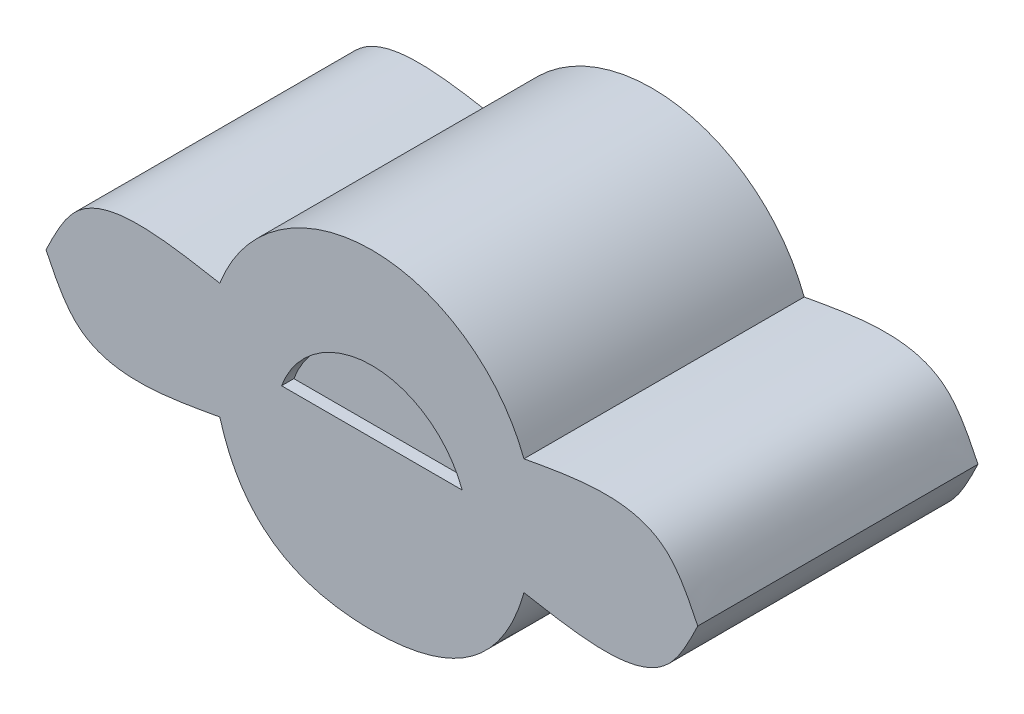
ISO-10303-21;
HEADER;
FILE_DESCRIPTION(('STEP AP214'),'2;1');
FILE_NAME('part.step','',(''),(''),'','','');
FILE_SCHEMA(('AUTOMOTIVE_DESIGN { 1 0 10303 214 1 1 1 1 }'));
ENDSEC;
DATA;
#1=APPLICATION_CONTEXT('core data for automotive mechanical design processes');
#2=APPLICATION_PROTOCOL_DEFINITION('international standard','automotive_design',2000,#1);
#3=PRODUCT_CONTEXT('',#1,'mechanical');
#4=PRODUCT('Part','Part','',(#3));
#5=PRODUCT_RELATED_PRODUCT_CATEGORY('part','',(#4));
#6=PRODUCT_DEFINITION_FORMATION('','',#4);
#7=PRODUCT_DEFINITION_CONTEXT('part definition',#1,'design');
#8=PRODUCT_DEFINITION('design','',#6,#7);
#9=PRODUCT_DEFINITION_SHAPE('','',#8);
#10=(LENGTH_UNIT() NAMED_UNIT(*) SI_UNIT(.MILLI.,.METRE.));
#11=(NAMED_UNIT(*) PLANE_ANGLE_UNIT() SI_UNIT($,.RADIAN.));
#12=(NAMED_UNIT(*) SI_UNIT($,.STERADIAN.) SOLID_ANGLE_UNIT());
#13=UNCERTAINTY_MEASURE_WITH_UNIT(LENGTH_MEASURE(1.E-05),#10,'distance_accuracy_value','');
#14=(GEOMETRIC_REPRESENTATION_CONTEXT(3) GLOBAL_UNCERTAINTY_ASSIGNED_CONTEXT((#13)) GLOBAL_UNIT_ASSIGNED_CONTEXT((#10,
#11,#12)) REPRESENTATION_CONTEXT('',''));
#15=CARTESIAN_POINT('',(0.,0.,0.));
#16=DIRECTION('',(0.,0.,1.));
#17=DIRECTION('',(1.,0.,0.));
#18=AXIS2_PLACEMENT_3D('',#15,#16,#17);
#19=CARTESIAN_POINT('',(3.44980996711875,-2.85158609272652,9.8298));
#20=DIRECTION('',(0.,0.,1.));
#21=DIRECTION('',(1.,0.,0.));
#22=AXIS2_PLACEMENT_3D('',#19,#20,#21);
#23=PLANE('',#22);
#24=CARTESIAN_POINT('',(0.,-3.77659383312862,9.8298));
#25=CARTESIAN_POINT('',(2.82201690300253,-3.77659383312862,9.8298));
#26=CARTESIAN_POINT('',(4.59947634264747,-2.57990652538969,9.8298));
#27=CARTESIAN_POINT('',(5.334,0.0334061668713814,9.8298));
#28=B_SPLINE_CURVE_WITH_KNOTS('',3,(#24,#25,#26,#27),.UNSPECIFIED.,.F.,.F.,(4,4),(0.,1.),.UNSPECIFIED.);
#29=CARTESIAN_POINT('',(0.,-3.77659383312862,9.8298));
#30=VERTEX_POINT('',#29);
#31=CARTESIAN_POINT('',(5.334,0.0334061668713817,9.8298));
#32=VERTEX_POINT('',#31);
#33=EDGE_CURVE('E131',#30,#32,#28,.T.);
#34=ORIENTED_EDGE('',*,*,#33,.T.);
#35=CARTESIAN_POINT('',(5.334,0.0334061668713817,9.8298));
#36=CARTESIAN_POINT('',(7.29632422328585,-0.322574833789406,9.8298));
#37=CARTESIAN_POINT('',(10.0317807757206,-0.818808101077559,9.8298));
#38=CARTESIAN_POINT('',(11.1218965082509,1.42985741208614,9.8298));
#39=CARTESIAN_POINT('',(11.43,2.06540616687138,9.8298));
#40=B_SPLINE_CURVE_WITH_KNOTS('',3,(#35,#36,#37,#38,#39),.UNSPECIFIED.,.F.,.F.,(4,1,4),(0.,
0.717366255201258,1.),.UNSPECIFIED.);
#41=CARTESIAN_POINT('',(11.43,2.06540616687138,9.8298));
#42=VERTEX_POINT('',#41);
#43=EDGE_CURVE('E137',#32,#42,#40,.T.);
#44=ORIENTED_EDGE('',*,*,#43,.T.);
#45=CARTESIAN_POINT('',(11.43,2.06540616687138,9.8298));
#46=CARTESIAN_POINT('',(11.1218965082509,2.70095492165662,9.8298));
#47=CARTESIAN_POINT('',(10.0317807757206,4.94962043482032,9.8298));
#48=CARTESIAN_POINT('',(7.29632422328585,4.45338716753217,9.8298));
#49=CARTESIAN_POINT('',(5.334,4.09740616687138,9.8298));
#50=B_SPLINE_CURVE_WITH_KNOTS('',3,(#45,#46,#47,#48,#49),.UNSPECIFIED.,.F.,.F.,(4,1,4),(0.,
0.282633744798742,1.),.UNSPECIFIED.);
#51=CARTESIAN_POINT('',(5.334,4.09740616687138,9.8298));
#52=VERTEX_POINT('',#51);
#53=EDGE_CURVE('E146',#42,#52,#50,.T.);
#54=ORIENTED_EDGE('',*,*,#53,.T.);
#55=CARTESIAN_POINT('',(0.,2.06540616687138,9.8298));
#56=DIRECTION('',(0.,0.,1.));
#57=DIRECTION('',(-1.,0.,0.));
#58=AXIS2_PLACEMENT_3D('',#55,#56,#57);
#59=CIRCLE('',#58,5.70794008377803);
#60=CARTESIAN_POINT('',(-5.334,4.09740616687138,9.8298));
#61=VERTEX_POINT('',#60);
#62=EDGE_CURVE('E179',#52,#61,#59,.T.);
#63=ORIENTED_EDGE('',*,*,#62,.T.);
#64=CARTESIAN_POINT('',(-5.334,4.09740616687138,9.8298));
#65=CARTESIAN_POINT('',(-7.29632422328585,4.45338716753217,9.8298));
#66=CARTESIAN_POINT('',(-10.0317807757206,4.94962043482032,9.8298));
#67=CARTESIAN_POINT('',(-11.1218965082509,2.70095492165662,9.8298));
#68=CARTESIAN_POINT('',(-11.43,2.06540616687138,9.8298));
#69=B_SPLINE_CURVE_WITH_KNOTS('',3,(#64,#65,#66,#67,#68),.UNSPECIFIED.,.F.,.F.,(4,1,4),(0.,
0.717366255201258,1.),.UNSPECIFIED.);
#70=CARTESIAN_POINT('',(-11.43,2.06540616687138,9.8298));
#71=VERTEX_POINT('',#70);
#72=EDGE_CURVE('E174',#61,#71,#69,.T.);
#73=ORIENTED_EDGE('',*,*,#72,.T.);
#74=CARTESIAN_POINT('',(-11.43,2.06540616687138,9.8298));
#75=CARTESIAN_POINT('',(-11.1218965082509,1.42985741208614,9.8298));
#76=CARTESIAN_POINT('',(-10.0317807757206,-0.818808101077561,9.8298));
#77=CARTESIAN_POINT('',(-7.29632422328584,-0.322574833789408,9.8298));
#78=CARTESIAN_POINT('',(-5.334,0.03340616687138,9.8298));
#79=B_SPLINE_CURVE_WITH_KNOTS('',3,(#74,#75,#76,#77,#78),.UNSPECIFIED.,.F.,.F.,(4,1,4),(0.,
0.282633744798742,1.),.UNSPECIFIED.);
#80=CARTESIAN_POINT('',(-5.334,0.0334061668713797,9.8298));
#81=VERTEX_POINT('',#80);
#82=EDGE_CURVE('E178',#71,#81,#79,.T.);
#83=ORIENTED_EDGE('',*,*,#82,.T.);
#84=CARTESIAN_POINT('',(-5.334,0.0334061668713797,9.8298));
#85=CARTESIAN_POINT('',(-4.59947634264747,-2.5799065253897,9.8298));
#86=CARTESIAN_POINT('',(-2.82201690300253,-3.77659383312862,9.8298));
#87=CARTESIAN_POINT('',(0.,-3.77659383312862,9.8298));
#88=B_SPLINE_CURVE_WITH_KNOTS('',3,(#84,#85,#86,#87),.UNSPECIFIED.,.F.,.F.,(4,4),(0.,1.),.UNSPECIFIED.);
#89=EDGE_CURVE('E187',#81,#30,#88,.T.);
#90=ORIENTED_EDGE('',*,*,#89,.T.);
#91=EDGE_LOOP('',(#34,#44,#54,#63,#73,#83,#90));
#92=FACE_BOUND('',#91,.T.);
#93=DIRECTION('',(1.,0.,0.));
#94=VECTOR('',#93,1.);
#95=CARTESIAN_POINT('',(-3.16794008377803,2.06540616687139,9.8298));
#96=LINE('',#95,#94);
#97=CARTESIAN_POINT('',(-3.16794008377803,2.06540616687138,9.8298));
#98=VERTEX_POINT('',#97);
#99=CARTESIAN_POINT('',(3.16794008377803,2.06540616687138,9.8298));
#100=VERTEX_POINT('',#99);
#101=EDGE_CURVE('E115',#98,#100,#96,.T.);
#102=ORIENTED_EDGE('',*,*,#101,.F.);
#103=CARTESIAN_POINT('',(0.,0.888739764897585,9.8298));
#104=DIRECTION('',(0.,0.,1.));
#105=DIRECTION('',(-1.,0.,0.));
#106=AXIS2_PLACEMENT_3D('',#103,#104,#105);
#107=CIRCLE('',#106,3.37940648575183);
#108=EDGE_CURVE('E125',#100,#98,#107,.T.);
#109=ORIENTED_EDGE('',*,*,#108,.F.);
#110=EDGE_LOOP('',(#102,#109));
#111=FACE_BOUND('',#110,.T.);
#112=ADVANCED_FACE('F43',(#92,#111),#23,.T.);
#113=CARTESIAN_POINT('',(3.44980996711875,-2.85158609272652,0.));
#114=DIRECTION('',(0.,0.,1.));
#115=DIRECTION('',(1.,0.,0.));
#116=AXIS2_PLACEMENT_3D('',#113,#114,#115);
#117=PLANE('',#116);
#118=CARTESIAN_POINT('',(0.,-3.77659383312862,0.));
#119=CARTESIAN_POINT('',(2.82201690300253,-3.77659383312862,0.));
#120=CARTESIAN_POINT('',(4.59947634264747,-2.57990652538969,0.));
#121=CARTESIAN_POINT('',(5.334,0.0334061668713814,0.));
#122=B_SPLINE_CURVE_WITH_KNOTS('',3,(#118,#119,#120,#121),.UNSPECIFIED.,.F.,.F.,(4,4),(0.,1.),.UNSPECIFIED.);
#123=CARTESIAN_POINT('',(0.,-3.77659383312862,0.));
#124=VERTEX_POINT('',#123);
#125=CARTESIAN_POINT('',(5.334,0.0334061668713817,0.));
#126=VERTEX_POINT('',#125);
#127=EDGE_CURVE('E130',#124,#126,#122,.T.);
#128=ORIENTED_EDGE('',*,*,#127,.F.);
#129=CARTESIAN_POINT('',(-5.334,0.0334061668713797,0.));
#130=CARTESIAN_POINT('',(-4.59947634264747,-2.5799065253897,0.));
#131=CARTESIAN_POINT('',(-2.82201690300253,-3.77659383312862,0.));
#132=CARTESIAN_POINT('',(0.,-3.77659383312862,0.));
#133=B_SPLINE_CURVE_WITH_KNOTS('',3,(#129,#130,#131,#132),.UNSPECIFIED.,.F.,.F.,(4,4),(0.,1.),.UNSPECIFIED.);
#134=CARTESIAN_POINT('',(-5.334,0.0334061668713797,0.));
#135=VERTEX_POINT('',#134);
#136=EDGE_CURVE('E138',#135,#124,#133,.T.);
#137=ORIENTED_EDGE('',*,*,#136,.F.);
#138=CARTESIAN_POINT('',(-11.43,2.06540616687138,0.));
#139=CARTESIAN_POINT('',(-11.1218965082509,1.42985741208614,0.));
#140=CARTESIAN_POINT('',(-10.0317807757206,-0.818808101077561,0.));
#141=CARTESIAN_POINT('',(-7.29632422328584,-0.322574833789408,0.));
#142=CARTESIAN_POINT('',(-5.334,0.03340616687138,0.));
#143=B_SPLINE_CURVE_WITH_KNOTS('',3,(#138,#139,#140,#141,#142),.UNSPECIFIED.,.F.,.F.,(4,1,4),
(0.,0.282633744798742,1.),.UNSPECIFIED.);
#144=CARTESIAN_POINT('',(-11.43,2.06540616687138,0.));
#145=VERTEX_POINT('',#144);
#146=EDGE_CURVE('E374',#145,#135,#143,.T.);
#147=ORIENTED_EDGE('',*,*,#146,.F.);
#148=CARTESIAN_POINT('',(-5.334,4.09740616687138,0.));
#149=CARTESIAN_POINT('',(-7.29632422328585,4.45338716753217,0.));
#150=CARTESIAN_POINT('',(-10.0317807757206,4.94962043482032,0.));
#151=CARTESIAN_POINT('',(-11.1218965082509,2.70095492165662,0.));
#152=CARTESIAN_POINT('',(-11.43,2.06540616687138,0.));
#153=B_SPLINE_CURVE_WITH_KNOTS('',3,(#148,#149,#150,#151,#152),.UNSPECIFIED.,.F.,.F.,(4,1,4),
(0.,0.717366255201258,1.),.UNSPECIFIED.);
#154=CARTESIAN_POINT('',(-5.334,4.09740616687138,0.));
#155=VERTEX_POINT('',#154);
#156=EDGE_CURVE('E370',#155,#145,#153,.T.);
#157=ORIENTED_EDGE('',*,*,#156,.F.);
#158=CARTESIAN_POINT('',(0.,2.06540616687138,0.));
#159=DIRECTION('',(0.,0.,1.));
#160=DIRECTION('',(-1.,0.,0.));
#161=AXIS2_PLACEMENT_3D('',#158,#159,#160);
#162=CIRCLE('',#161,5.70794008377803);
#163=CARTESIAN_POINT('',(5.334,4.09740616687138,0.));
#164=VERTEX_POINT('',#163);
#165=EDGE_CURVE('E356',#164,#155,#162,.T.);
#166=ORIENTED_EDGE('',*,*,#165,.F.);
#167=CARTESIAN_POINT('',(11.43,2.06540616687138,0.));
#168=CARTESIAN_POINT('',(11.1218965082509,2.70095492165662,0.));
#169=CARTESIAN_POINT('',(10.0317807757206,4.94962043482032,0.));
#170=CARTESIAN_POINT('',(7.29632422328585,4.45338716753217,0.));
#171=CARTESIAN_POINT('',(5.334,4.09740616687138,0.));
#172=B_SPLINE_CURVE_WITH_KNOTS('',3,(#167,#168,#169,#170,#171),.UNSPECIFIED.,.F.,.F.,(4,1,4),
(0.,0.282633744798742,1.),.UNSPECIFIED.);
#173=CARTESIAN_POINT('',(11.43,2.06540616687138,0.));
#174=VERTEX_POINT('',#173);
#175=EDGE_CURVE('E353',#174,#164,#172,.T.);
#176=ORIENTED_EDGE('',*,*,#175,.F.);
#177=CARTESIAN_POINT('',(5.334,0.0334061668713817,0.));
#178=CARTESIAN_POINT('',(7.29632422328585,-0.322574833789406,0.));
#179=CARTESIAN_POINT('',(10.0317807757206,-0.818808101077559,0.));
#180=CARTESIAN_POINT('',(11.1218965082509,1.42985741208614,0.));
#181=CARTESIAN_POINT('',(11.43,2.06540616687138,0.));
#182=B_SPLINE_CURVE_WITH_KNOTS('',3,(#177,#178,#179,#180,#181),.UNSPECIFIED.,.F.,.F.,(4,1,4),
(0.,0.717366255201258,1.),.UNSPECIFIED.);
#183=EDGE_CURVE('E352',#126,#174,#182,.T.);
#184=ORIENTED_EDGE('',*,*,#183,.F.);
#185=EDGE_LOOP('',(#128,#137,#147,#157,#166,#176,#184));
#186=FACE_BOUND('',#185,.T.);
#187=ADVANCED_FACE('F206',(#186),#117,.F.);
#188=DIRECTION('',(0.,0.,-1.));
#189=VECTOR('',#188,1.);
#190=SURFACE_OF_LINEAR_EXTRUSION('',#28,#189);
#191=ORIENTED_EDGE('',*,*,#127,.T.);
#192=DIRECTION('',(0.,0.,-1.));
#193=VECTOR('',#192,1.);
#194=CARTESIAN_POINT('',(5.334,0.0334061668713817,9.8298));
#195=LINE('',#194,#193);
#196=EDGE_CURVE('E11',#32,#126,#195,.T.);
#197=ORIENTED_EDGE('',*,*,#196,.F.);
#198=ORIENTED_EDGE('',*,*,#33,.F.);
#199=DIRECTION('',(0.,0.,-1.));
#200=VECTOR('',#199,1.);
#201=CARTESIAN_POINT('',(0.,-3.77659383312862,9.8298));
#202=LINE('',#201,#200);
#203=EDGE_CURVE('E195',#30,#124,#202,.T.);
#204=ORIENTED_EDGE('',*,*,#203,.T.);
#205=EDGE_LOOP('',(#191,#197,#198,#204));
#206=FACE_BOUND('',#205,.T.);
#207=ADVANCED_FACE('F45',(#206),#190,.F.);
#208=DIRECTION('',(0.,0.,-1.));
#209=VECTOR('',#208,1.);
#210=SURFACE_OF_LINEAR_EXTRUSION('',#40,#209);
#211=ORIENTED_EDGE('',*,*,#183,.T.);
#212=DIRECTION('',(0.,0.,-1.));
#213=VECTOR('',#212,1.);
#214=CARTESIAN_POINT('',(11.43,2.06540616687138,9.8298));
#215=LINE('',#214,#213);
#216=EDGE_CURVE('E52',#42,#174,#215,.T.);
#217=ORIENTED_EDGE('',*,*,#216,.F.);
#218=ORIENTED_EDGE('',*,*,#43,.F.);
#219=ORIENTED_EDGE('',*,*,#196,.T.);
#220=EDGE_LOOP('',(#211,#217,#218,#219));
#221=FACE_BOUND('',#220,.T.);
#222=ADVANCED_FACE('F154',(#221),#210,.F.);
#223=DIRECTION('',(0.,0.,-1.));
#224=VECTOR('',#223,1.);
#225=SURFACE_OF_LINEAR_EXTRUSION('',#50,#224);
#226=ORIENTED_EDGE('',*,*,#175,.T.);
#227=DIRECTION('',(0.,0.,-1.));
#228=VECTOR('',#227,1.);
#229=CARTESIAN_POINT('',(5.334,4.09740616687138,9.8298));
#230=LINE('',#229,#228);
#231=EDGE_CURVE('E400',#52,#164,#230,.T.);
#232=ORIENTED_EDGE('',*,*,#231,.F.);
#233=ORIENTED_EDGE('',*,*,#53,.F.);
#234=ORIENTED_EDGE('',*,*,#216,.T.);
#235=EDGE_LOOP('',(#226,#232,#233,#234));
#236=FACE_BOUND('',#235,.T.);
#237=ADVANCED_FACE('F157',(#236),#225,.F.);
#238=CARTESIAN_POINT('',(0.,2.06540616687138,9.8298));
#239=DIRECTION('',(0.,0.,-1.));
#240=DIRECTION('',(-1.,0.,0.));
#241=AXIS2_PLACEMENT_3D('',#238,#239,#240);
#242=CYLINDRICAL_SURFACE('',#241,5.70794008377803);
#243=ORIENTED_EDGE('',*,*,#165,.T.);
#244=DIRECTION('',(0.,0.,-1.));
#245=VECTOR('',#244,1.);
#246=CARTESIAN_POINT('',(-5.334,4.09740616687138,9.8298));
#247=LINE('',#246,#245);
#248=EDGE_CURVE('E397',#61,#155,#247,.T.);
#249=ORIENTED_EDGE('',*,*,#248,.F.);
#250=ORIENTED_EDGE('',*,*,#62,.F.);
#251=ORIENTED_EDGE('',*,*,#231,.T.);
#252=EDGE_LOOP('',(#243,#249,#250,#251));
#253=FACE_BOUND('',#252,.T.);
#254=ADVANCED_FACE('F161',(#253),#242,.T.);
#255=DIRECTION('',(0.,0.,-1.));
#256=VECTOR('',#255,1.);
#257=SURFACE_OF_LINEAR_EXTRUSION('',#69,#256);
#258=ORIENTED_EDGE('',*,*,#156,.T.);
#259=DIRECTION('',(0.,0.,-1.));
#260=VECTOR('',#259,1.);
#261=CARTESIAN_POINT('',(-11.43,2.06540616687138,9.8298));
#262=LINE('',#261,#260);
#263=EDGE_CURVE('E394',#71,#145,#262,.T.);
#264=ORIENTED_EDGE('',*,*,#263,.F.);
#265=ORIENTED_EDGE('',*,*,#72,.F.);
#266=ORIENTED_EDGE('',*,*,#248,.T.);
#267=EDGE_LOOP('',(#258,#264,#265,#266));
#268=FACE_BOUND('',#267,.T.);
#269=ADVANCED_FACE('F165',(#268),#257,.F.);
#270=DIRECTION('',(0.,0.,-1.));
#271=VECTOR('',#270,1.);
#272=SURFACE_OF_LINEAR_EXTRUSION('',#79,#271);
#273=ORIENTED_EDGE('',*,*,#146,.T.);
#274=DIRECTION('',(0.,0.,-1.));
#275=VECTOR('',#274,1.);
#276=CARTESIAN_POINT('',(-5.334,0.0334061668713797,9.8298));
#277=LINE('',#276,#275);
#278=EDGE_CURVE('E391',#81,#135,#277,.T.);
#279=ORIENTED_EDGE('',*,*,#278,.F.);
#280=ORIENTED_EDGE('',*,*,#82,.F.);
#281=ORIENTED_EDGE('',*,*,#263,.T.);
#282=EDGE_LOOP('',(#273,#279,#280,#281));
#283=FACE_BOUND('',#282,.T.);
#284=ADVANCED_FACE('F170',(#283),#272,.F.);
#285=DIRECTION('',(0.,0.,-1.));
#286=VECTOR('',#285,1.);
#287=SURFACE_OF_LINEAR_EXTRUSION('',#88,#286);
#288=ORIENTED_EDGE('',*,*,#136,.T.);
#289=ORIENTED_EDGE('',*,*,#203,.F.);
#290=ORIENTED_EDGE('',*,*,#89,.F.);
#291=ORIENTED_EDGE('',*,*,#278,.T.);
#292=EDGE_LOOP('',(#288,#289,#290,#291));
#293=FACE_BOUND('',#292,.T.);
#294=ADVANCED_FACE('F202',(#293),#287,.F.);
#295=CARTESIAN_POINT('',(0.,0.888739764897585,9.8298));
#296=DIRECTION('',(0.,0.,-1.));
#297=DIRECTION('',(-1.,0.,0.));
#298=AXIS2_PLACEMENT_3D('',#295,#296,#297);
#299=CYLINDRICAL_SURFACE('',#298,3.37940648575183);
#300=CARTESIAN_POINT('',(0.,0.888739764897585,9.398));
#301=DIRECTION('',(0.,0.,1.));
#302=DIRECTION('',(1.,0.,0.));
#303=AXIS2_PLACEMENT_3D('',#300,#301,#302);
#304=CIRCLE('',#303,3.37940648575183);
#305=CARTESIAN_POINT('',(-3.16794008377803,2.06540616687139,9.398));
#306=VERTEX_POINT('',#305);
#307=CARTESIAN_POINT('',(3.16794008377803,2.06540616687138,9.398));
#308=VERTEX_POINT('',#307);
#309=EDGE_CURVE('E120',#306,#308,#304,.F.);
#310=ORIENTED_EDGE('',*,*,#309,.T.);
#311=DIRECTION('',(0.,0.,-1.));
#312=VECTOR('',#311,1.);
#313=CARTESIAN_POINT('',(3.16794008377803,2.06540616687138,9.8298));
#314=LINE('',#313,#312);
#315=EDGE_CURVE('E111',#100,#308,#314,.T.);
#316=ORIENTED_EDGE('',*,*,#315,.F.);
#317=ORIENTED_EDGE('',*,*,#108,.T.);
#318=DIRECTION('',(0.,0.,-1.));
#319=VECTOR('',#318,1.);
#320=CARTESIAN_POINT('',(-3.16794008377803,2.06540616687139,9.8298));
#321=LINE('',#320,#319);
#322=EDGE_CURVE('E63',#98,#306,#321,.T.);
#323=ORIENTED_EDGE('',*,*,#322,.T.);
#324=EDGE_LOOP('',(#310,#316,#317,#323));
#325=FACE_BOUND('',#324,.T.);
#326=ADVANCED_FACE('F121',(#325),#299,.F.);
#327=CARTESIAN_POINT('',(-3.16794008377803,2.06540616687139,9.8298));
#328=DIRECTION('',(0.,1.,0.));
#329=DIRECTION('',(-1.,0.,0.));
#330=AXIS2_PLACEMENT_3D('',#327,#328,#329);
#331=PLANE('',#330);
#332=DIRECTION('',(1.,0.,0.));
#333=VECTOR('',#332,1.);
#334=CARTESIAN_POINT('',(0.,2.06540616687138,9.398));
#335=LINE('',#334,#333);
#336=EDGE_CURVE('E59',#306,#308,#335,.T.);
#337=ORIENTED_EDGE('',*,*,#336,.F.);
#338=ORIENTED_EDGE('',*,*,#322,.F.);
#339=ORIENTED_EDGE('',*,*,#101,.T.);
#340=ORIENTED_EDGE('',*,*,#315,.T.);
#341=EDGE_LOOP('',(#337,#338,#339,#340));
#342=FACE_BOUND('',#341,.T.);
#343=ADVANCED_FACE('F113',(#342),#331,.T.);
#344=CARTESIAN_POINT('',(0.,0.,9.398));
#345=DIRECTION('',(0.,0.,1.));
#346=DIRECTION('',(1.,0.,0.));
#347=AXIS2_PLACEMENT_3D('',#344,#345,#346);
#348=PLANE('',#347);
#349=ORIENTED_EDGE('',*,*,#309,.F.);
#350=ORIENTED_EDGE('',*,*,#336,.T.);
#351=EDGE_LOOP('',(#349,#350));
#352=FACE_BOUND('',#351,.T.);
#353=ADVANCED_FACE('F124',(#352),#348,.T.);
#354=CLOSED_SHELL('',(#112,#187,#207,#222,#237,#254,#269,#284,#294,#326,#343,#353));
#355=MANIFOLD_SOLID_BREP('B2',#354);
#356=ADVANCED_BREP_SHAPE_REPRESENTATION('',(#18,#355),#14);
#357=SHAPE_DEFINITION_REPRESENTATION(#9,#356);
ENDSEC;
END-ISO-10303-21;
